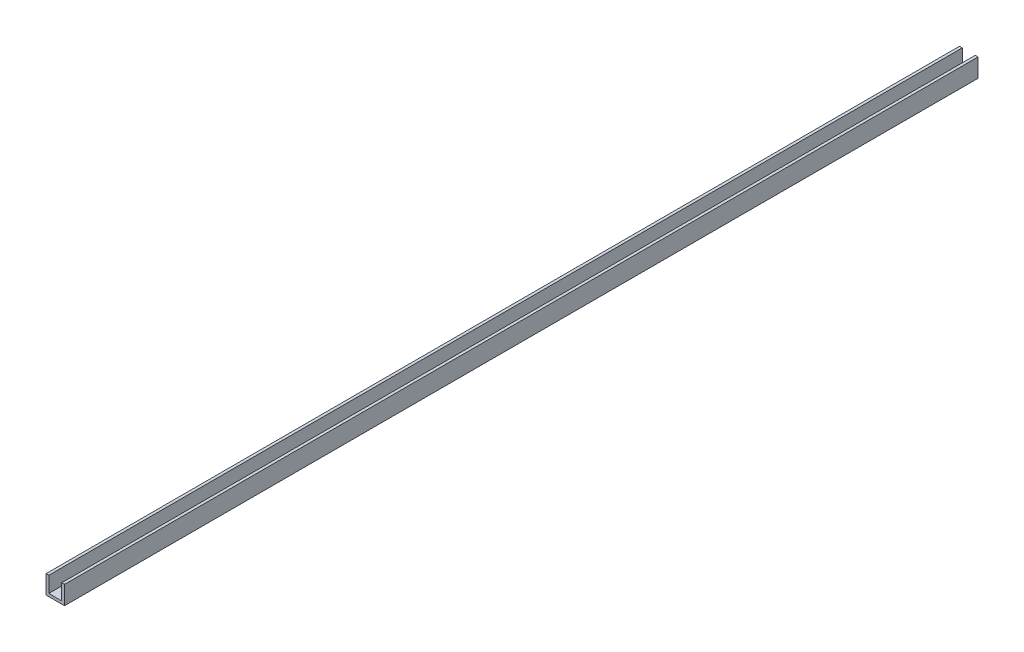
ISO-10303-21;
HEADER;
FILE_DESCRIPTION(('STEP AP214'),'2;1');
FILE_NAME('part.step','',(''),(''),'','','');
FILE_SCHEMA(('AUTOMOTIVE_DESIGN { 1 0 10303 214 1 1 1 1 }'));
ENDSEC;
DATA;
#1=APPLICATION_CONTEXT('core data for automotive mechanical design processes');
#2=APPLICATION_PROTOCOL_DEFINITION('international standard','automotive_design',2000,#1);
#3=PRODUCT_CONTEXT('',#1,'mechanical');
#4=PRODUCT('Part','Part','',(#3));
#5=PRODUCT_RELATED_PRODUCT_CATEGORY('part','',(#4));
#6=PRODUCT_DEFINITION_FORMATION('','',#4);
#7=PRODUCT_DEFINITION_CONTEXT('part definition',#1,'design');
#8=PRODUCT_DEFINITION('design','',#6,#7);
#9=PRODUCT_DEFINITION_SHAPE('','',#8);
#10=(LENGTH_UNIT() NAMED_UNIT(*) SI_UNIT(.MILLI.,.METRE.));
#11=(NAMED_UNIT(*) PLANE_ANGLE_UNIT() SI_UNIT($,.RADIAN.));
#12=(NAMED_UNIT(*) SI_UNIT($,.STERADIAN.) SOLID_ANGLE_UNIT());
#13=UNCERTAINTY_MEASURE_WITH_UNIT(LENGTH_MEASURE(1.E-05),#10,'distance_accuracy_value','');
#14=(GEOMETRIC_REPRESENTATION_CONTEXT(3) GLOBAL_UNCERTAINTY_ASSIGNED_CONTEXT((#13)) GLOBAL_UNIT_ASSIGNED_CONTEXT((#10,
#11,#12)) REPRESENTATION_CONTEXT('',''));
#15=CARTESIAN_POINT('',(0.,0.,0.));
#16=DIRECTION('',(0.,0.,1.));
#17=DIRECTION('',(1.,0.,0.));
#18=AXIS2_PLACEMENT_3D('',#15,#16,#17);
#19=CARTESIAN_POINT('',(0.,10.,493.));
#20=DIRECTION('',(1.,0.,0.));
#21=DIRECTION('',(0.,1.,0.));
#22=AXIS2_PLACEMENT_3D('',#19,#20,#21);
#23=PLANE('',#22);
#24=DIRECTION('',(0.,-1.,0.));
#25=VECTOR('',#24,1.);
#26=CARTESIAN_POINT('',(0.,10.,0.));
#27=LINE('',#26,#25);
#28=CARTESIAN_POINT('',(0.,10.,0.));
#29=VERTEX_POINT('',#28);
#30=CARTESIAN_POINT('',(0.,0.,0.));
#31=VERTEX_POINT('',#30);
#32=EDGE_CURVE('E130',#29,#31,#27,.T.);
#33=ORIENTED_EDGE('',*,*,#32,.T.);
#34=DIRECTION('',(0.,0.,-1.));
#35=VECTOR('',#34,1.);
#36=CARTESIAN_POINT('',(0.,0.,493.));
#37=LINE('',#36,#35);
#38=CARTESIAN_POINT('',(0.,0.,493.));
#39=VERTEX_POINT('',#38);
#40=EDGE_CURVE('E11',#39,#31,#37,.T.);
#41=ORIENTED_EDGE('',*,*,#40,.F.);
#42=DIRECTION('',(0.,-1.,0.));
#43=VECTOR('',#42,1.);
#44=CARTESIAN_POINT('',(0.,10.,493.));
#45=LINE('',#44,#43);
#46=CARTESIAN_POINT('',(0.,10.,493.));
#47=VERTEX_POINT('',#46);
#48=EDGE_CURVE('E144',#47,#39,#45,.T.);
#49=ORIENTED_EDGE('',*,*,#48,.F.);
#50=DIRECTION('',(0.,0.,-1.));
#51=VECTOR('',#50,1.);
#52=CARTESIAN_POINT('',(0.,10.,493.));
#53=LINE('',#52,#51);
#54=EDGE_CURVE('E126',#47,#29,#53,.T.);
#55=ORIENTED_EDGE('',*,*,#54,.T.);
#56=EDGE_LOOP('',(#33,#41,#49,#55));
#57=FACE_BOUND('',#56,.T.);
#58=ADVANCED_FACE('F34',(#57),#23,.F.);
#59=CARTESIAN_POINT('',(0.,0.,493.));
#60=DIRECTION('',(0.,1.,0.));
#61=DIRECTION('',(0.,0.,1.));
#62=AXIS2_PLACEMENT_3D('',#59,#60,#61);
#63=PLANE('',#62);
#64=DIRECTION('',(1.,0.,0.));
#65=VECTOR('',#64,1.);
#66=CARTESIAN_POINT('',(0.,0.,0.));
#67=LINE('',#66,#65);
#68=CARTESIAN_POINT('',(10.,0.,0.));
#69=VERTEX_POINT('',#68);
#70=EDGE_CURVE('E133',#31,#69,#67,.T.);
#71=ORIENTED_EDGE('',*,*,#70,.T.);
#72=DIRECTION('',(0.,0.,-1.));
#73=VECTOR('',#72,1.);
#74=CARTESIAN_POINT('',(10.,0.,493.));
#75=LINE('',#74,#73);
#76=CARTESIAN_POINT('',(10.,0.,493.));
#77=VERTEX_POINT('',#76);
#78=EDGE_CURVE('E42',#77,#69,#75,.T.);
#79=ORIENTED_EDGE('',*,*,#78,.F.);
#80=DIRECTION('',(1.,0.,0.));
#81=VECTOR('',#80,1.);
#82=CARTESIAN_POINT('',(0.,0.,493.));
#83=LINE('',#82,#81);
#84=EDGE_CURVE('E93',#39,#77,#83,.T.);
#85=ORIENTED_EDGE('',*,*,#84,.F.);
#86=ORIENTED_EDGE('',*,*,#40,.T.);
#87=EDGE_LOOP('',(#71,#79,#85,#86));
#88=FACE_BOUND('',#87,.T.);
#89=ADVANCED_FACE('F179',(#88),#63,.F.);
#90=CARTESIAN_POINT('',(10.,0.,493.));
#91=DIRECTION('',(-1.,0.,0.));
#92=DIRECTION('',(0.,0.,1.));
#93=AXIS2_PLACEMENT_3D('',#90,#91,#92);
#94=PLANE('',#93);
#95=DIRECTION('',(0.,1.,0.));
#96=VECTOR('',#95,1.);
#97=CARTESIAN_POINT('',(10.,0.,0.));
#98=LINE('',#97,#96);
#99=CARTESIAN_POINT('',(10.,10.,0.));
#100=VERTEX_POINT('',#99);
#101=EDGE_CURVE('E135',#69,#100,#98,.T.);
#102=ORIENTED_EDGE('',*,*,#101,.T.);
#103=DIRECTION('',(0.,0.,-1.));
#104=VECTOR('',#103,1.);
#105=CARTESIAN_POINT('',(10.,10.,493.));
#106=LINE('',#105,#104);
#107=CARTESIAN_POINT('',(10.,10.,493.));
#108=VERTEX_POINT('',#107);
#109=EDGE_CURVE('E151',#108,#100,#106,.T.);
#110=ORIENTED_EDGE('',*,*,#109,.F.);
#111=DIRECTION('',(0.,1.,0.));
#112=VECTOR('',#111,1.);
#113=CARTESIAN_POINT('',(10.,0.,493.));
#114=LINE('',#113,#112);
#115=EDGE_CURVE('E159',#77,#108,#114,.T.);
#116=ORIENTED_EDGE('',*,*,#115,.F.);
#117=ORIENTED_EDGE('',*,*,#78,.T.);
#118=EDGE_LOOP('',(#102,#110,#116,#117));
#119=FACE_BOUND('',#118,.T.);
#120=ADVANCED_FACE('F157',(#119),#94,.F.);
#121=CARTESIAN_POINT('',(10.,10.,493.));
#122=DIRECTION('',(0.,-1.,0.));
#123=DIRECTION('',(1.,0.,0.));
#124=AXIS2_PLACEMENT_3D('',#121,#122,#123);
#125=PLANE('',#124);
#126=DIRECTION('',(-1.,0.,0.));
#127=VECTOR('',#126,1.);
#128=CARTESIAN_POINT('',(10.,10.,0.));
#129=LINE('',#128,#127);
#130=CARTESIAN_POINT('',(8.5,10.,0.));
#131=VERTEX_POINT('',#130);
#132=EDGE_CURVE('E137',#100,#131,#129,.T.);
#133=ORIENTED_EDGE('',*,*,#132,.T.);
#134=DIRECTION('',(0.,0.,-1.));
#135=VECTOR('',#134,1.);
#136=CARTESIAN_POINT('',(8.5,10.,493.));
#137=LINE('',#136,#135);
#138=CARTESIAN_POINT('',(8.5,10.,493.));
#139=VERTEX_POINT('',#138);
#140=EDGE_CURVE('E148',#139,#131,#137,.T.);
#141=ORIENTED_EDGE('',*,*,#140,.F.);
#142=DIRECTION('',(-1.,0.,0.));
#143=VECTOR('',#142,1.);
#144=CARTESIAN_POINT('',(10.,10.,493.));
#145=LINE('',#144,#143);
#146=EDGE_CURVE('E171',#108,#139,#145,.T.);
#147=ORIENTED_EDGE('',*,*,#146,.F.);
#148=ORIENTED_EDGE('',*,*,#109,.T.);
#149=EDGE_LOOP('',(#133,#141,#147,#148));
#150=FACE_BOUND('',#149,.T.);
#151=ADVANCED_FACE('F167',(#150),#125,.F.);
#152=CARTESIAN_POINT('',(8.5,10.,493.));
#153=DIRECTION('',(1.,0.,0.));
#154=DIRECTION('',(0.,0.,-1.));
#155=AXIS2_PLACEMENT_3D('',#152,#153,#154);
#156=PLANE('',#155);
#157=DIRECTION('',(0.,-1.,0.));
#158=VECTOR('',#157,1.);
#159=CARTESIAN_POINT('',(8.5,10.,0.));
#160=LINE('',#159,#158);
#161=CARTESIAN_POINT('',(8.5,1.5,0.));
#162=VERTEX_POINT('',#161);
#163=EDGE_CURVE('E139',#131,#162,#160,.T.);
#164=ORIENTED_EDGE('',*,*,#163,.T.);
#165=DIRECTION('',(0.,0.,-1.));
#166=VECTOR('',#165,1.);
#167=CARTESIAN_POINT('',(8.5,1.5,493.));
#168=LINE('',#167,#166);
#169=CARTESIAN_POINT('',(8.5,1.5,493.));
#170=VERTEX_POINT('',#169);
#171=EDGE_CURVE('E121',#170,#162,#168,.T.);
#172=ORIENTED_EDGE('',*,*,#171,.F.);
#173=DIRECTION('',(0.,-1.,0.));
#174=VECTOR('',#173,1.);
#175=CARTESIAN_POINT('',(8.5,10.,493.));
#176=LINE('',#175,#174);
#177=EDGE_CURVE('E112',#139,#170,#176,.T.);
#178=ORIENTED_EDGE('',*,*,#177,.F.);
#179=ORIENTED_EDGE('',*,*,#140,.T.);
#180=EDGE_LOOP('',(#164,#172,#178,#179));
#181=FACE_BOUND('',#180,.T.);
#182=ADVANCED_FACE('F170',(#181),#156,.F.);
#183=CARTESIAN_POINT('',(8.5,1.5,493.));
#184=DIRECTION('',(0.,-1.,0.));
#185=DIRECTION('',(1.,0.,0.));
#186=AXIS2_PLACEMENT_3D('',#183,#184,#185);
#187=PLANE('',#186);
#188=DIRECTION('',(-1.,0.,0.));
#189=VECTOR('',#188,1.);
#190=CARTESIAN_POINT('',(8.5,1.5,0.));
#191=LINE('',#190,#189);
#192=CARTESIAN_POINT('',(1.5,1.5,0.));
#193=VERTEX_POINT('',#192);
#194=EDGE_CURVE('E120',#162,#193,#191,.T.);
#195=ORIENTED_EDGE('',*,*,#194,.T.);
#196=DIRECTION('',(0.,0.,-1.));
#197=VECTOR('',#196,1.);
#198=CARTESIAN_POINT('',(1.5,1.5,493.));
#199=LINE('',#198,#197);
#200=CARTESIAN_POINT('',(1.5,1.5,493.));
#201=VERTEX_POINT('',#200);
#202=EDGE_CURVE('E117',#201,#193,#199,.T.);
#203=ORIENTED_EDGE('',*,*,#202,.F.);
#204=DIRECTION('',(-1.,0.,0.));
#205=VECTOR('',#204,1.);
#206=CARTESIAN_POINT('',(8.5,1.5,493.));
#207=LINE('',#206,#205);
#208=EDGE_CURVE('E106',#170,#201,#207,.T.);
#209=ORIENTED_EDGE('',*,*,#208,.F.);
#210=ORIENTED_EDGE('',*,*,#171,.T.);
#211=EDGE_LOOP('',(#195,#203,#209,#210));
#212=FACE_BOUND('',#211,.T.);
#213=ADVANCED_FACE('F118',(#212),#187,.F.);
#214=CARTESIAN_POINT('',(1.5,1.5,493.));
#215=DIRECTION('',(-1.,0.,0.));
#216=DIRECTION('',(0.,-1.,0.));
#217=AXIS2_PLACEMENT_3D('',#214,#215,#216);
#218=PLANE('',#217);
#219=DIRECTION('',(0.,1.,0.));
#220=VECTOR('',#219,1.);
#221=CARTESIAN_POINT('',(1.5,1.5,0.));
#222=LINE('',#221,#220);
#223=CARTESIAN_POINT('',(1.5,10.,0.));
#224=VERTEX_POINT('',#223);
#225=EDGE_CURVE('E79',#193,#224,#222,.T.);
#226=ORIENTED_EDGE('',*,*,#225,.T.);
#227=DIRECTION('',(0.,0.,-1.));
#228=VECTOR('',#227,1.);
#229=CARTESIAN_POINT('',(1.5,10.,493.));
#230=LINE('',#229,#228);
#231=CARTESIAN_POINT('',(1.5,10.,493.));
#232=VERTEX_POINT('',#231);
#233=EDGE_CURVE('E122',#232,#224,#230,.T.);
#234=ORIENTED_EDGE('',*,*,#233,.F.);
#235=DIRECTION('',(0.,1.,0.));
#236=VECTOR('',#235,1.);
#237=CARTESIAN_POINT('',(1.5,1.5,493.));
#238=LINE('',#237,#236);
#239=EDGE_CURVE('E110',#201,#232,#238,.T.);
#240=ORIENTED_EDGE('',*,*,#239,.F.);
#241=ORIENTED_EDGE('',*,*,#202,.T.);
#242=EDGE_LOOP('',(#226,#234,#240,#241));
#243=FACE_BOUND('',#242,.T.);
#244=ADVANCED_FACE('F124',(#243),#218,.F.);
#245=CARTESIAN_POINT('',(1.5,10.,493.));
#246=DIRECTION('',(0.,-1.,0.));
#247=DIRECTION('',(0.,0.,-1.));
#248=AXIS2_PLACEMENT_3D('',#245,#246,#247);
#249=PLANE('',#248);
#250=DIRECTION('',(-1.,0.,0.));
#251=VECTOR('',#250,1.);
#252=CARTESIAN_POINT('',(1.5,10.,0.));
#253=LINE('',#252,#251);
#254=EDGE_CURVE('E85',#224,#29,#253,.T.);
#255=ORIENTED_EDGE('',*,*,#254,.T.);
#256=ORIENTED_EDGE('',*,*,#54,.F.);
#257=DIRECTION('',(-1.,0.,0.));
#258=VECTOR('',#257,1.);
#259=CARTESIAN_POINT('',(1.5,10.,493.));
#260=LINE('',#259,#258);
#261=EDGE_CURVE('E50',#232,#47,#260,.T.);
#262=ORIENTED_EDGE('',*,*,#261,.F.);
#263=ORIENTED_EDGE('',*,*,#233,.T.);
#264=EDGE_LOOP('',(#255,#256,#262,#263));
#265=FACE_BOUND('',#264,.T.);
#266=ADVANCED_FACE('F195',(#265),#249,.F.);
#267=CARTESIAN_POINT('',(0.,0.,493.));
#268=DIRECTION('',(0.,0.,1.));
#269=DIRECTION('',(1.,0.,0.));
#270=AXIS2_PLACEMENT_3D('',#267,#268,#269);
#271=PLANE('',#270);
#272=ORIENTED_EDGE('',*,*,#48,.T.);
#273=ORIENTED_EDGE('',*,*,#84,.T.);
#274=ORIENTED_EDGE('',*,*,#115,.T.);
#275=ORIENTED_EDGE('',*,*,#146,.T.);
#276=ORIENTED_EDGE('',*,*,#177,.T.);
#277=ORIENTED_EDGE('',*,*,#208,.T.);
#278=ORIENTED_EDGE('',*,*,#239,.T.);
#279=ORIENTED_EDGE('',*,*,#261,.T.);
#280=EDGE_LOOP('',(#272,#273,#274,#275,#276,#277,#278,#279));
#281=FACE_BOUND('',#280,.T.);
#282=ADVANCED_FACE('F108',(#281),#271,.T.);
#283=CARTESIAN_POINT('',(0.,0.,0.));
#284=DIRECTION('',(0.,0.,1.));
#285=DIRECTION('',(1.,0.,0.));
#286=AXIS2_PLACEMENT_3D('',#283,#284,#285);
#287=PLANE('',#286);
#288=ORIENTED_EDGE('',*,*,#32,.F.);
#289=ORIENTED_EDGE('',*,*,#254,.F.);
#290=ORIENTED_EDGE('',*,*,#225,.F.);
#291=ORIENTED_EDGE('',*,*,#194,.F.);
#292=ORIENTED_EDGE('',*,*,#163,.F.);
#293=ORIENTED_EDGE('',*,*,#132,.F.);
#294=ORIENTED_EDGE('',*,*,#101,.F.);
#295=ORIENTED_EDGE('',*,*,#70,.F.);
#296=EDGE_LOOP('',(#288,#289,#290,#291,#292,#293,#294,#295));
#297=FACE_BOUND('',#296,.T.);
#298=ADVANCED_FACE('F163',(#297),#287,.F.);
#299=CLOSED_SHELL('',(#58,#89,#120,#151,#182,#213,#244,#266,#282,#298));
#300=MANIFOLD_SOLID_BREP('B2',#299);
#301=ADVANCED_BREP_SHAPE_REPRESENTATION('',(#18,#300),#14);
#302=SHAPE_DEFINITION_REPRESENTATION(#9,#301);
ENDSEC;
END-ISO-10303-21;
